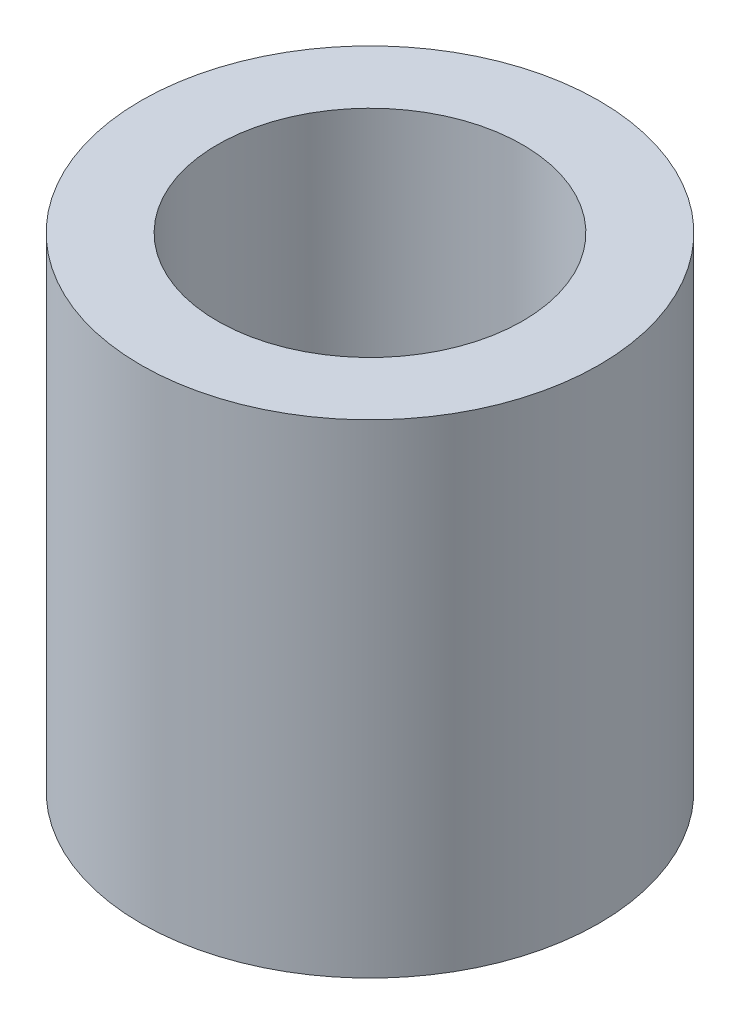
ISO-10303-21;
HEADER;
FILE_DESCRIPTION(('STEP AP214'),'2;1');
FILE_NAME('part.step','',(''),(''),'','','');
FILE_SCHEMA(('AUTOMOTIVE_DESIGN { 1 0 10303 214 1 1 1 1 }'));
ENDSEC;
DATA;
#1=APPLICATION_CONTEXT('core data for automotive mechanical design processes');
#2=APPLICATION_PROTOCOL_DEFINITION('international standard','automotive_design',2000,#1);
#3=PRODUCT_CONTEXT('',#1,'mechanical');
#4=PRODUCT('Part','Part','',(#3));
#5=PRODUCT_RELATED_PRODUCT_CATEGORY('part','',(#4));
#6=PRODUCT_DEFINITION_FORMATION('','',#4);
#7=PRODUCT_DEFINITION_CONTEXT('part definition',#1,'design');
#8=PRODUCT_DEFINITION('design','',#6,#7);
#9=PRODUCT_DEFINITION_SHAPE('','',#8);
#10=(LENGTH_UNIT() NAMED_UNIT(*) SI_UNIT(.MILLI.,.METRE.));
#11=(NAMED_UNIT(*) PLANE_ANGLE_UNIT() SI_UNIT($,.RADIAN.));
#12=(NAMED_UNIT(*) SI_UNIT($,.STERADIAN.) SOLID_ANGLE_UNIT());
#13=UNCERTAINTY_MEASURE_WITH_UNIT(LENGTH_MEASURE(1.E-05),#10,'distance_accuracy_value','');
#14=(GEOMETRIC_REPRESENTATION_CONTEXT(3) GLOBAL_UNCERTAINTY_ASSIGNED_CONTEXT((#13)) GLOBAL_UNIT_ASSIGNED_CONTEXT((#10,
#11,#12)) REPRESENTATION_CONTEXT('',''));
#15=CARTESIAN_POINT('',(0.,0.,0.));
#16=DIRECTION('',(0.,0.,1.));
#17=DIRECTION('',(1.,0.,0.));
#18=AXIS2_PLACEMENT_3D('',#15,#16,#17);
#19=CARTESIAN_POINT('',(0.,0.,0.));
#20=DIRECTION('',(0.,1.,0.));
#21=DIRECTION('',(1.,0.,0.));
#22=AXIS2_PLACEMENT_3D('',#19,#20,#21);
#23=PLANE('',#22);
#24=CARTESIAN_POINT('',(0.,0.,0.));
#25=DIRECTION('',(0.,1.,0.));
#26=DIRECTION('',(-1.,0.,0.));
#27=AXIS2_PLACEMENT_3D('',#24,#25,#26);
#28=CIRCLE('',#27,4.5);
#29=CARTESIAN_POINT('',(-4.5,0.,0.));
#30=VERTEX_POINT('',#29);
#31=EDGE_CURVE('E29',#30,#30,#28,.T.);
#32=ORIENTED_EDGE('',*,*,#31,.F.);
#33=EDGE_LOOP('',(#32));
#34=FACE_BOUND('',#33,.T.);
#35=CARTESIAN_POINT('',(0.,0.,0.));
#36=DIRECTION('',(0.,-1.,0.));
#37=DIRECTION('',(-1.,0.,0.));
#38=AXIS2_PLACEMENT_3D('',#35,#36,#37);
#39=CIRCLE('',#38,3.);
#40=CARTESIAN_POINT('',(-3.,0.,0.));
#41=VERTEX_POINT('',#40);
#42=EDGE_CURVE('E10',#41,#41,#39,.T.);
#43=ORIENTED_EDGE('',*,*,#42,.F.);
#44=EDGE_LOOP('',(#43));
#45=FACE_BOUND('',#44,.T.);
#46=ADVANCED_FACE('F15',(#34,#45),#23,.F.);
#47=CARTESIAN_POINT('',(0.,0.,0.));
#48=DIRECTION('',(0.,1.,0.));
#49=DIRECTION('',(1.,0.,0.));
#50=AXIS2_PLACEMENT_3D('',#47,#48,#49);
#51=CYLINDRICAL_SURFACE('',#50,3.);
#52=CARTESIAN_POINT('',(0.,9.5,0.));
#53=DIRECTION('',(0.,-1.,0.));
#54=DIRECTION('',(1.,0.,0.));
#55=AXIS2_PLACEMENT_3D('',#52,#53,#54);
#56=CIRCLE('',#55,3.);
#57=CARTESIAN_POINT('',(3.,9.5,0.));
#58=VERTEX_POINT('',#57);
#59=EDGE_CURVE('E27',#58,#58,#56,.T.);
#60=ORIENTED_EDGE('',*,*,#59,.F.);
#61=EDGE_LOOP('',(#60));
#62=FACE_BOUND('',#61,.T.);
#63=ORIENTED_EDGE('',*,*,#42,.T.);
#64=EDGE_LOOP('',(#63));
#65=FACE_BOUND('',#64,.T.);
#66=ADVANCED_FACE('F39',(#62,#65),#51,.F.);
#67=CARTESIAN_POINT('',(0.,9.5,0.));
#68=DIRECTION('',(0.,1.,0.));
#69=DIRECTION('',(1.,0.,0.));
#70=AXIS2_PLACEMENT_3D('',#67,#68,#69);
#71=PLANE('',#70);
#72=CARTESIAN_POINT('',(0.,9.5,0.));
#73=DIRECTION('',(0.,1.,0.));
#74=DIRECTION('',(-1.,0.,0.));
#75=AXIS2_PLACEMENT_3D('',#72,#73,#74);
#76=CIRCLE('',#75,4.5);
#77=CARTESIAN_POINT('',(-4.5,9.5,0.));
#78=VERTEX_POINT('',#77);
#79=EDGE_CURVE('E19',#78,#78,#76,.T.);
#80=ORIENTED_EDGE('',*,*,#79,.T.);
#81=EDGE_LOOP('',(#80));
#82=FACE_BOUND('',#81,.T.);
#83=ORIENTED_EDGE('',*,*,#59,.T.);
#84=EDGE_LOOP('',(#83));
#85=FACE_BOUND('',#84,.T.);
#86=ADVANCED_FACE('F45',(#82,#85),#71,.T.);
#87=CARTESIAN_POINT('',(0.,0.,0.));
#88=DIRECTION('',(0.,1.,0.));
#89=DIRECTION('',(1.,0.,0.));
#90=AXIS2_PLACEMENT_3D('',#87,#88,#89);
#91=CYLINDRICAL_SURFACE('',#90,4.5);
#92=ORIENTED_EDGE('',*,*,#79,.F.);
#93=EDGE_LOOP('',(#92));
#94=FACE_BOUND('',#93,.T.);
#95=ORIENTED_EDGE('',*,*,#31,.T.);
#96=EDGE_LOOP('',(#95));
#97=FACE_BOUND('',#96,.T.);
#98=ADVANCED_FACE('F17',(#94,#97),#91,.T.);
#99=CLOSED_SHELL('',(#46,#66,#86,#98));
#100=MANIFOLD_SOLID_BREP('B1',#99);
#101=ADVANCED_BREP_SHAPE_REPRESENTATION('',(#18,#100),#14);
#102=SHAPE_DEFINITION_REPRESENTATION(#9,#101);
ENDSEC;
END-ISO-10303-21;
